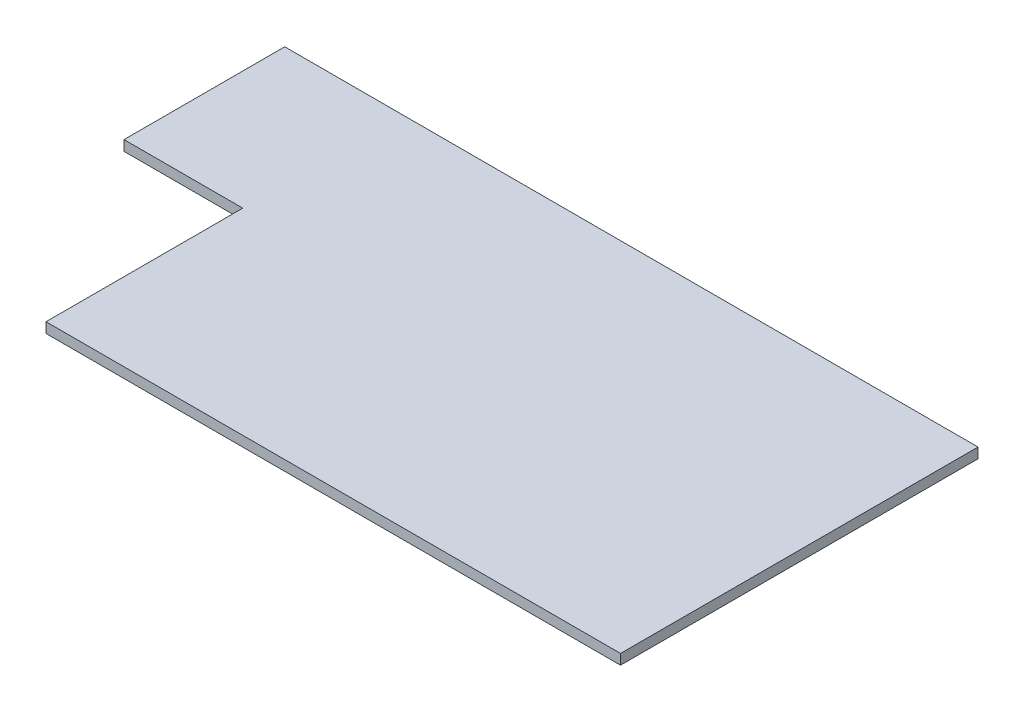
ISO-10303-21;
HEADER;
FILE_DESCRIPTION(('STEP AP214'),'2;1');
FILE_NAME('part.step','',(''),(''),'','','');
FILE_SCHEMA(('AUTOMOTIVE_DESIGN { 1 0 10303 214 1 1 1 1 }'));
ENDSEC;
DATA;
#1=APPLICATION_CONTEXT('core data for automotive mechanical design processes');
#2=APPLICATION_PROTOCOL_DEFINITION('international standard','automotive_design',2000,#1);
#3=PRODUCT_CONTEXT('',#1,'mechanical');
#4=PRODUCT('Part','Part','',(#3));
#5=PRODUCT_RELATED_PRODUCT_CATEGORY('part','',(#4));
#6=PRODUCT_DEFINITION_FORMATION('','',#4);
#7=PRODUCT_DEFINITION_CONTEXT('part definition',#1,'design');
#8=PRODUCT_DEFINITION('design','',#6,#7);
#9=PRODUCT_DEFINITION_SHAPE('','',#8);
#10=(LENGTH_UNIT() NAMED_UNIT(*) SI_UNIT(.MILLI.,.METRE.));
#11=(NAMED_UNIT(*) PLANE_ANGLE_UNIT() SI_UNIT($,.RADIAN.));
#12=(NAMED_UNIT(*) SI_UNIT($,.STERADIAN.) SOLID_ANGLE_UNIT());
#13=UNCERTAINTY_MEASURE_WITH_UNIT(LENGTH_MEASURE(1.E-05),#10,'distance_accuracy_value','');
#14=(GEOMETRIC_REPRESENTATION_CONTEXT(3) GLOBAL_UNCERTAINTY_ASSIGNED_CONTEXT((#13)) GLOBAL_UNIT_ASSIGNED_CONTEXT((#10,
#11,#12)) REPRESENTATION_CONTEXT('',''));
#15=CARTESIAN_POINT('',(0.,0.,0.));
#16=DIRECTION('',(0.,0.,1.));
#17=DIRECTION('',(1.,0.,0.));
#18=AXIS2_PLACEMENT_3D('',#15,#16,#17);
#19=CARTESIAN_POINT('',(0.,0.,0.));
#20=DIRECTION('',(0.,1.,0.));
#21=DIRECTION('',(0.,0.,1.));
#22=AXIS2_PLACEMENT_3D('',#19,#20,#21);
#23=PLANE('',#22);
#24=DIRECTION('',(1.,0.,0.));
#25=VECTOR('',#24,1.);
#26=CARTESIAN_POINT('',(-27.15,0.,-14.));
#27=LINE('',#26,#25);
#28=CARTESIAN_POINT('',(-27.15,0.,-14.));
#29=VERTEX_POINT('',#28);
#30=CARTESIAN_POINT('',(27.15,0.,-14.));
#31=VERTEX_POINT('',#30);
#32=EDGE_CURVE('E103',#29,#31,#27,.T.);
#33=ORIENTED_EDGE('',*,*,#32,.T.);
#34=DIRECTION('',(0.,0.,1.));
#35=VECTOR('',#34,1.);
#36=CARTESIAN_POINT('',(27.15,0.,-14.));
#37=LINE('',#36,#35);
#38=CARTESIAN_POINT('',(27.15,0.,14.));
#39=VERTEX_POINT('',#38);
#40=EDGE_CURVE('E98',#31,#39,#37,.T.);
#41=ORIENTED_EDGE('',*,*,#40,.T.);
#42=DIRECTION('',(-1.,0.,0.));
#43=VECTOR('',#42,1.);
#44=CARTESIAN_POINT('',(-17.85,0.,14.));
#45=LINE('',#44,#43);
#46=CARTESIAN_POINT('',(-17.85,0.,14.));
#47=VERTEX_POINT('',#46);
#48=EDGE_CURVE('E94',#39,#47,#45,.T.);
#49=ORIENTED_EDGE('',*,*,#48,.T.);
#50=DIRECTION('',(0.,0.,-1.));
#51=VECTOR('',#50,1.);
#52=CARTESIAN_POINT('',(-17.85,0.,-1.41));
#53=LINE('',#52,#51);
#54=CARTESIAN_POINT('',(-17.85,0.,-1.41));
#55=VERTEX_POINT('',#54);
#56=EDGE_CURVE('E81',#47,#55,#53,.T.);
#57=ORIENTED_EDGE('',*,*,#56,.T.);
#58=DIRECTION('',(-1.,0.,0.));
#59=VECTOR('',#58,1.);
#60=CARTESIAN_POINT('',(-27.15,0.,-1.41));
#61=LINE('',#60,#59);
#62=CARTESIAN_POINT('',(-27.15,0.,-1.41));
#63=VERTEX_POINT('',#62);
#64=EDGE_CURVE('E67',#55,#63,#61,.T.);
#65=ORIENTED_EDGE('',*,*,#64,.T.);
#66=DIRECTION('',(0.,0.,-1.));
#67=VECTOR('',#66,1.);
#68=CARTESIAN_POINT('',(-27.15,0.,-14.));
#69=LINE('',#68,#67);
#70=EDGE_CURVE('E20',#63,#29,#69,.T.);
#71=ORIENTED_EDGE('',*,*,#70,.T.);
#72=EDGE_LOOP('',(#33,#41,#49,#57,#65,#71));
#73=FACE_BOUND('',#72,.T.);
#74=ADVANCED_FACE('F17',(#73),#23,.F.);
#75=CARTESIAN_POINT('',(-27.15,0.8,-14.));
#76=DIRECTION('',(1.,0.,0.));
#77=DIRECTION('',(0.,0.,-1.));
#78=AXIS2_PLACEMENT_3D('',#75,#76,#77);
#79=PLANE('',#78);
#80=DIRECTION('',(0.,1.,0.));
#81=VECTOR('',#80,1.);
#82=CARTESIAN_POINT('',(-27.15,0.8,-1.41));
#83=LINE('',#82,#81);
#84=CARTESIAN_POINT('',(-27.15,0.8,-1.41));
#85=VERTEX_POINT('',#84);
#86=EDGE_CURVE('E73',#63,#85,#83,.T.);
#87=ORIENTED_EDGE('',*,*,#86,.T.);
#88=DIRECTION('',(0.,0.,1.));
#89=VECTOR('',#88,1.);
#90=CARTESIAN_POINT('',(-27.15,0.8,0.));
#91=LINE('',#90,#89);
#92=CARTESIAN_POINT('',(-27.15,0.8,-14.));
#93=VERTEX_POINT('',#92);
#94=EDGE_CURVE('E105',#93,#85,#91,.T.);
#95=ORIENTED_EDGE('',*,*,#94,.F.);
#96=DIRECTION('',(0.,1.,0.));
#97=VECTOR('',#96,1.);
#98=CARTESIAN_POINT('',(-27.15,0.8,-14.));
#99=LINE('',#98,#97);
#100=EDGE_CURVE('E76',#93,#29,#99,.F.);
#101=ORIENTED_EDGE('',*,*,#100,.T.);
#102=ORIENTED_EDGE('',*,*,#70,.F.);
#103=EDGE_LOOP('',(#87,#95,#101,#102));
#104=FACE_BOUND('',#103,.T.);
#105=ADVANCED_FACE('F72',(#104),#79,.F.);
#106=CARTESIAN_POINT('',(-27.15,0.8,-1.41));
#107=DIRECTION('',(0.,0.,-1.));
#108=DIRECTION('',(-1.,0.,0.));
#109=AXIS2_PLACEMENT_3D('',#106,#107,#108);
#110=PLANE('',#109);
#111=DIRECTION('',(0.,1.,0.));
#112=VECTOR('',#111,1.);
#113=CARTESIAN_POINT('',(-17.85,0.8,-1.41));
#114=LINE('',#113,#112);
#115=CARTESIAN_POINT('',(-17.85,0.8,-1.41));
#116=VERTEX_POINT('',#115);
#117=EDGE_CURVE('E83',#55,#116,#114,.T.);
#118=ORIENTED_EDGE('',*,*,#117,.T.);
#119=DIRECTION('',(1.,0.,0.));
#120=VECTOR('',#119,1.);
#121=CARTESIAN_POINT('',(0.,0.8,-1.41));
#122=LINE('',#121,#120);
#123=EDGE_CURVE('E87',#85,#116,#122,.T.);
#124=ORIENTED_EDGE('',*,*,#123,.F.);
#125=ORIENTED_EDGE('',*,*,#86,.F.);
#126=ORIENTED_EDGE('',*,*,#64,.F.);
#127=EDGE_LOOP('',(#118,#124,#125,#126));
#128=FACE_BOUND('',#127,.T.);
#129=ADVANCED_FACE('F85',(#128),#110,.F.);
#130=CARTESIAN_POINT('',(-17.85,0.8,-1.41));
#131=DIRECTION('',(1.,0.,0.));
#132=DIRECTION('',(0.,0.,-1.));
#133=AXIS2_PLACEMENT_3D('',#130,#131,#132);
#134=PLANE('',#133);
#135=DIRECTION('',(0.,1.,0.));
#136=VECTOR('',#135,1.);
#137=CARTESIAN_POINT('',(-17.85,0.8,14.));
#138=LINE('',#137,#136);
#139=CARTESIAN_POINT('',(-17.85,0.8,14.));
#140=VERTEX_POINT('',#139);
#141=EDGE_CURVE('E92',#47,#140,#138,.T.);
#142=ORIENTED_EDGE('',*,*,#141,.T.);
#143=DIRECTION('',(0.,0.,1.));
#144=VECTOR('',#143,1.);
#145=CARTESIAN_POINT('',(-17.85,0.8,0.));
#146=LINE('',#145,#144);
#147=EDGE_CURVE('E108',#116,#140,#146,.T.);
#148=ORIENTED_EDGE('',*,*,#147,.F.);
#149=ORIENTED_EDGE('',*,*,#117,.F.);
#150=ORIENTED_EDGE('',*,*,#56,.F.);
#151=EDGE_LOOP('',(#142,#148,#149,#150));
#152=FACE_BOUND('',#151,.T.);
#153=ADVANCED_FACE('F137',(#152),#134,.F.);
#154=CARTESIAN_POINT('',(-17.85,0.8,14.));
#155=DIRECTION('',(0.,0.,-1.));
#156=DIRECTION('',(-1.,0.,0.));
#157=AXIS2_PLACEMENT_3D('',#154,#155,#156);
#158=PLANE('',#157);
#159=DIRECTION('',(0.,1.,0.));
#160=VECTOR('',#159,1.);
#161=CARTESIAN_POINT('',(27.15,0.8,14.));
#162=LINE('',#161,#160);
#163=CARTESIAN_POINT('',(27.15,0.8,14.));
#164=VERTEX_POINT('',#163);
#165=EDGE_CURVE('E96',#39,#164,#162,.T.);
#166=ORIENTED_EDGE('',*,*,#165,.T.);
#167=DIRECTION('',(1.,0.,0.));
#168=VECTOR('',#167,1.);
#169=CARTESIAN_POINT('',(0.,0.8,14.));
#170=LINE('',#169,#168);
#171=EDGE_CURVE('E111',#140,#164,#170,.T.);
#172=ORIENTED_EDGE('',*,*,#171,.F.);
#173=ORIENTED_EDGE('',*,*,#141,.F.);
#174=ORIENTED_EDGE('',*,*,#48,.F.);
#175=EDGE_LOOP('',(#166,#172,#173,#174));
#176=FACE_BOUND('',#175,.T.);
#177=ADVANCED_FACE('F121',(#176),#158,.F.);
#178=CARTESIAN_POINT('',(27.15,0.8,-14.));
#179=DIRECTION('',(-1.,0.,0.));
#180=DIRECTION('',(0.,0.,1.));
#181=AXIS2_PLACEMENT_3D('',#178,#179,#180);
#182=PLANE('',#181);
#183=DIRECTION('',(0.,1.,0.));
#184=VECTOR('',#183,1.);
#185=CARTESIAN_POINT('',(27.15,0.8,-14.));
#186=LINE('',#185,#184);
#187=CARTESIAN_POINT('',(27.15,0.8,-14.));
#188=VERTEX_POINT('',#187);
#189=EDGE_CURVE('E35',#31,#188,#186,.T.);
#190=ORIENTED_EDGE('',*,*,#189,.T.);
#191=DIRECTION('',(0.,0.,1.));
#192=VECTOR('',#191,1.);
#193=CARTESIAN_POINT('',(27.15,0.8,0.));
#194=LINE('',#193,#192);
#195=EDGE_CURVE('E26',#164,#188,#194,.F.);
#196=ORIENTED_EDGE('',*,*,#195,.F.);
#197=ORIENTED_EDGE('',*,*,#165,.F.);
#198=ORIENTED_EDGE('',*,*,#40,.F.);
#199=EDGE_LOOP('',(#190,#196,#197,#198));
#200=FACE_BOUND('',#199,.T.);
#201=ADVANCED_FACE('F119',(#200),#182,.F.);
#202=CARTESIAN_POINT('',(-27.15,0.8,-14.));
#203=DIRECTION('',(0.,0.,1.));
#204=DIRECTION('',(1.,0.,0.));
#205=AXIS2_PLACEMENT_3D('',#202,#203,#204);
#206=PLANE('',#205);
#207=ORIENTED_EDGE('',*,*,#100,.F.);
#208=DIRECTION('',(1.,0.,0.));
#209=VECTOR('',#208,1.);
#210=CARTESIAN_POINT('',(0.,0.8,-14.));
#211=LINE('',#210,#209);
#212=EDGE_CURVE('E11',#188,#93,#211,.F.);
#213=ORIENTED_EDGE('',*,*,#212,.F.);
#214=ORIENTED_EDGE('',*,*,#189,.F.);
#215=ORIENTED_EDGE('',*,*,#32,.F.);
#216=EDGE_LOOP('',(#207,#213,#214,#215));
#217=FACE_BOUND('',#216,.T.);
#218=ADVANCED_FACE('F124',(#217),#206,.F.);
#219=CARTESIAN_POINT('',(0.,0.8,0.));
#220=DIRECTION('',(0.,1.,0.));
#221=DIRECTION('',(0.,0.,1.));
#222=AXIS2_PLACEMENT_3D('',#219,#220,#221);
#223=PLANE('',#222);
#224=ORIENTED_EDGE('',*,*,#195,.T.);
#225=ORIENTED_EDGE('',*,*,#212,.T.);
#226=ORIENTED_EDGE('',*,*,#94,.T.);
#227=ORIENTED_EDGE('',*,*,#123,.T.);
#228=ORIENTED_EDGE('',*,*,#147,.T.);
#229=ORIENTED_EDGE('',*,*,#171,.T.);
#230=EDGE_LOOP('',(#224,#225,#226,#227,#228,#229));
#231=FACE_BOUND('',#230,.T.);
#232=ADVANCED_FACE('F116',(#231),#223,.T.);
#233=CLOSED_SHELL('',(#74,#105,#129,#153,#177,#201,#218,#232));
#234=MANIFOLD_SOLID_BREP('B1',#233);
#235=ADVANCED_BREP_SHAPE_REPRESENTATION('',(#18,#234),#14);
#236=SHAPE_DEFINITION_REPRESENTATION(#9,#235);
ENDSEC;
END-ISO-10303-21;
